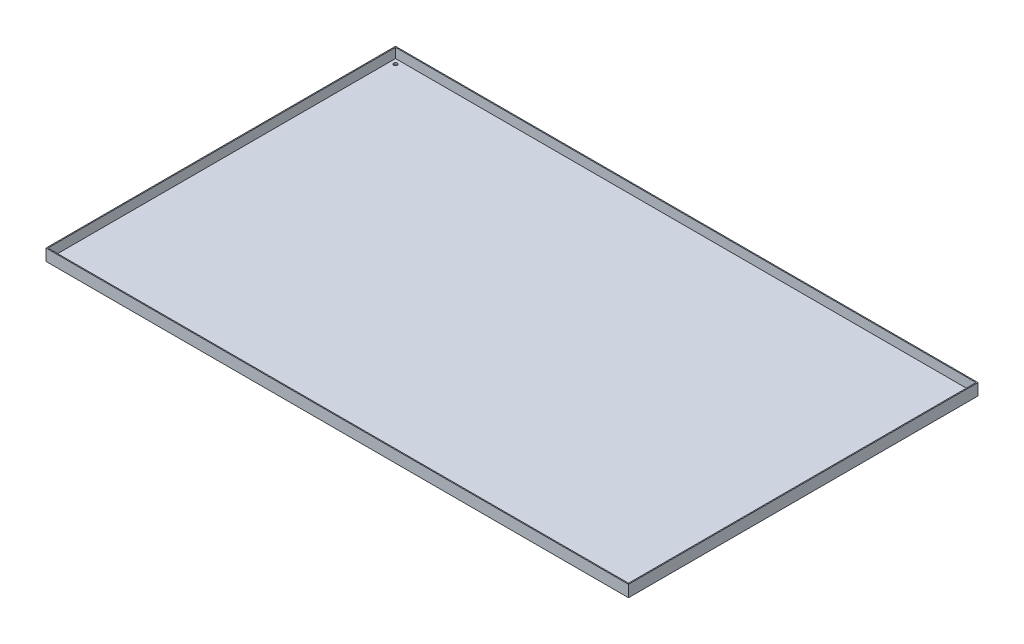
ISO-10303-21;
HEADER;
FILE_DESCRIPTION(('STEP AP214'),'2;1');
FILE_NAME('part.step','',(''),(''),'','','');
FILE_SCHEMA(('AUTOMOTIVE_DESIGN { 1 0 10303 214 1 1 1 1 }'));
ENDSEC;
DATA;
#1=APPLICATION_CONTEXT('core data for automotive mechanical design processes');
#2=APPLICATION_PROTOCOL_DEFINITION('international standard','automotive_design',2000,#1);
#3=PRODUCT_CONTEXT('',#1,'mechanical');
#4=PRODUCT('Part','Part','',(#3));
#5=PRODUCT_RELATED_PRODUCT_CATEGORY('part','',(#4));
#6=PRODUCT_DEFINITION_FORMATION('','',#4);
#7=PRODUCT_DEFINITION_CONTEXT('part definition',#1,'design');
#8=PRODUCT_DEFINITION('design','',#6,#7);
#9=PRODUCT_DEFINITION_SHAPE('','',#8);
#10=(LENGTH_UNIT() NAMED_UNIT(*) SI_UNIT(.MILLI.,.METRE.));
#11=(NAMED_UNIT(*) PLANE_ANGLE_UNIT() SI_UNIT($,.RADIAN.));
#12=(NAMED_UNIT(*) SI_UNIT($,.STERADIAN.) SOLID_ANGLE_UNIT());
#13=UNCERTAINTY_MEASURE_WITH_UNIT(LENGTH_MEASURE(1.E-05),#10,'distance_accuracy_value','');
#14=(GEOMETRIC_REPRESENTATION_CONTEXT(3) GLOBAL_UNCERTAINTY_ASSIGNED_CONTEXT((#13)) GLOBAL_UNIT_ASSIGNED_CONTEXT((#10,
#11,#12)) REPRESENTATION_CONTEXT('',''));
#15=CARTESIAN_POINT('',(0.,0.,0.));
#16=DIRECTION('',(0.,0.,1.));
#17=DIRECTION('',(1.,0.,0.));
#18=AXIS2_PLACEMENT_3D('',#15,#16,#17);
#19=CARTESIAN_POINT('',(0.,60.,0.));
#20=DIRECTION('',(1.,0.,0.));
#21=DIRECTION('',(0.,0.,-1.));
#22=AXIS2_PLACEMENT_3D('',#19,#20,#21);
#23=PLANE('',#22);
#24=DIRECTION('',(0.,0.,1.));
#25=VECTOR('',#24,1.);
#26=CARTESIAN_POINT('',(0.,0.,0.));
#27=LINE('',#26,#25);
#28=CARTESIAN_POINT('',(0.,0.,-1800.));
#29=VERTEX_POINT('',#28);
#30=CARTESIAN_POINT('',(0.,0.,0.));
#31=VERTEX_POINT('',#30);
#32=EDGE_CURVE('E162',#29,#31,#27,.T.);
#33=ORIENTED_EDGE('',*,*,#32,.T.);
#34=DIRECTION('',(0.,-1.,0.));
#35=VECTOR('',#34,1.);
#36=CARTESIAN_POINT('',(0.,60.,0.));
#37=LINE('',#36,#35);
#38=CARTESIAN_POINT('',(0.,60.,0.));
#39=VERTEX_POINT('',#38);
#40=EDGE_CURVE('E11',#39,#31,#37,.T.);
#41=ORIENTED_EDGE('',*,*,#40,.F.);
#42=DIRECTION('',(0.,0.,1.));
#43=VECTOR('',#42,1.);
#44=CARTESIAN_POINT('',(0.,60.,0.));
#45=LINE('',#44,#43);
#46=CARTESIAN_POINT('',(0.,60.,-1800.));
#47=VERTEX_POINT('',#46);
#48=EDGE_CURVE('E168',#47,#39,#45,.T.);
#49=ORIENTED_EDGE('',*,*,#48,.F.);
#50=DIRECTION('',(0.,-1.,0.));
#51=VECTOR('',#50,1.);
#52=CARTESIAN_POINT('',(0.,60.,-1800.));
#53=LINE('',#52,#51);
#54=EDGE_CURVE('E178',#47,#29,#53,.T.);
#55=ORIENTED_EDGE('',*,*,#54,.T.);
#56=EDGE_LOOP('',(#33,#41,#49,#55));
#57=FACE_BOUND('',#56,.T.);
#58=ADVANCED_FACE('F39',(#57),#23,.F.);
#59=CARTESIAN_POINT('',(0.,60.,0.));
#60=DIRECTION('',(0.,0.,-1.));
#61=DIRECTION('',(-1.,0.,0.));
#62=AXIS2_PLACEMENT_3D('',#59,#60,#61);
#63=PLANE('',#62);
#64=DIRECTION('',(1.,0.,0.));
#65=VECTOR('',#64,1.);
#66=CARTESIAN_POINT('',(0.,0.,0.));
#67=LINE('',#66,#65);
#68=CARTESIAN_POINT('',(3000.,0.,0.));
#69=VERTEX_POINT('',#68);
#70=EDGE_CURVE('E182',#31,#69,#67,.T.);
#71=ORIENTED_EDGE('',*,*,#70,.T.);
#72=DIRECTION('',(0.,-1.,0.));
#73=VECTOR('',#72,1.);
#74=CARTESIAN_POINT('',(3000.,60.,0.));
#75=LINE('',#74,#73);
#76=CARTESIAN_POINT('',(3000.,60.,0.));
#77=VERTEX_POINT('',#76);
#78=EDGE_CURVE('E47',#77,#69,#75,.T.);
#79=ORIENTED_EDGE('',*,*,#78,.F.);
#80=DIRECTION('',(1.,0.,0.));
#81=VECTOR('',#80,1.);
#82=CARTESIAN_POINT('',(0.,60.,0.));
#83=LINE('',#82,#81);
#84=EDGE_CURVE('E91',#39,#77,#83,.T.);
#85=ORIENTED_EDGE('',*,*,#84,.F.);
#86=ORIENTED_EDGE('',*,*,#40,.T.);
#87=EDGE_LOOP('',(#71,#79,#85,#86));
#88=FACE_BOUND('',#87,.T.);
#89=ADVANCED_FACE('F217',(#88),#63,.F.);
#90=CARTESIAN_POINT('',(3000.,60.,0.));
#91=DIRECTION('',(-1.,0.,0.));
#92=DIRECTION('',(0.,0.,1.));
#93=AXIS2_PLACEMENT_3D('',#90,#91,#92);
#94=PLANE('',#93);
#95=DIRECTION('',(0.,0.,-1.));
#96=VECTOR('',#95,1.);
#97=CARTESIAN_POINT('',(3000.,0.,0.));
#98=LINE('',#97,#96);
#99=CARTESIAN_POINT('',(3000.,0.,-1800.));
#100=VERTEX_POINT('',#99);
#101=EDGE_CURVE('E185',#69,#100,#98,.T.);
#102=ORIENTED_EDGE('',*,*,#101,.T.);
#103=DIRECTION('',(0.,-1.,0.));
#104=VECTOR('',#103,1.);
#105=CARTESIAN_POINT('',(3000.,60.,-1800.));
#106=LINE('',#105,#104);
#107=CARTESIAN_POINT('',(3000.,60.,-1800.));
#108=VERTEX_POINT('',#107);
#109=EDGE_CURVE('E192',#108,#100,#106,.T.);
#110=ORIENTED_EDGE('',*,*,#109,.F.);
#111=DIRECTION('',(0.,0.,-1.));
#112=VECTOR('',#111,1.);
#113=CARTESIAN_POINT('',(3000.,60.,0.));
#114=LINE('',#113,#112);
#115=EDGE_CURVE('E173',#77,#108,#114,.T.);
#116=ORIENTED_EDGE('',*,*,#115,.F.);
#117=ORIENTED_EDGE('',*,*,#78,.T.);
#118=EDGE_LOOP('',(#102,#110,#116,#117));
#119=FACE_BOUND('',#118,.T.);
#120=ADVANCED_FACE('F199',(#119),#94,.F.);
#121=CARTESIAN_POINT('',(0.,60.,-1800.));
#122=DIRECTION('',(0.,0.,1.));
#123=DIRECTION('',(1.,0.,0.));
#124=AXIS2_PLACEMENT_3D('',#121,#122,#123);
#125=PLANE('',#124);
#126=DIRECTION('',(-1.,0.,0.));
#127=VECTOR('',#126,1.);
#128=CARTESIAN_POINT('',(0.,0.,-1800.));
#129=LINE('',#128,#127);
#130=EDGE_CURVE('E84',#100,#29,#129,.T.);
#131=ORIENTED_EDGE('',*,*,#130,.T.);
#132=ORIENTED_EDGE('',*,*,#54,.F.);
#133=DIRECTION('',(-1.,0.,0.));
#134=VECTOR('',#133,1.);
#135=CARTESIAN_POINT('',(0.,60.,-1800.));
#136=LINE('',#135,#134);
#137=EDGE_CURVE('E63',#108,#47,#136,.T.);
#138=ORIENTED_EDGE('',*,*,#137,.F.);
#139=ORIENTED_EDGE('',*,*,#109,.T.);
#140=EDGE_LOOP('',(#131,#132,#138,#139));
#141=FACE_BOUND('',#140,.T.);
#142=ADVANCED_FACE('F207',(#141),#125,.F.);
#143=CARTESIAN_POINT('',(0.,60.,0.));
#144=DIRECTION('',(0.,-1.,0.));
#145=DIRECTION('',(0.,0.,-1.));
#146=AXIS2_PLACEMENT_3D('',#143,#144,#145);
#147=PLANE('',#146);
#148=DIRECTION('',(1.,0.,0.));
#149=VECTOR('',#148,1.);
#150=CARTESIAN_POINT('',(5.00000000000022,60.,-5.));
#151=LINE('',#150,#149);
#152=CARTESIAN_POINT('',(5.00000000000022,60.,-5.));
#153=VERTEX_POINT('',#152);
#154=CARTESIAN_POINT('',(2995.,60.,-5.));
#155=VERTEX_POINT('',#154);
#156=EDGE_CURVE('E152',#153,#155,#151,.T.);
#157=ORIENTED_EDGE('',*,*,#156,.F.);
#158=DIRECTION('',(0.,0.,1.));
#159=VECTOR('',#158,1.);
#160=CARTESIAN_POINT('',(5.,60.,-1795.));
#161=LINE('',#160,#159);
#162=CARTESIAN_POINT('',(5.,60.,-1795.));
#163=VERTEX_POINT('',#162);
#164=EDGE_CURVE('E54',#163,#153,#161,.T.);
#165=ORIENTED_EDGE('',*,*,#164,.F.);
#166=DIRECTION('',(-1.,0.,0.));
#167=VECTOR('',#166,1.);
#168=CARTESIAN_POINT('',(5.,60.,-1795.));
#169=LINE('',#168,#167);
#170=CARTESIAN_POINT('',(2995.,60.,-1795.));
#171=VERTEX_POINT('',#170);
#172=EDGE_CURVE('E136',#171,#163,#169,.T.);
#173=ORIENTED_EDGE('',*,*,#172,.F.);
#174=DIRECTION('',(0.,0.,-1.));
#175=VECTOR('',#174,1.);
#176=CARTESIAN_POINT('',(2995.,60.,-1795.));
#177=LINE('',#176,#175);
#178=EDGE_CURVE('E140',#155,#171,#177,.T.);
#179=ORIENTED_EDGE('',*,*,#178,.F.);
#180=EDGE_LOOP('',(#157,#165,#173,#179));
#181=FACE_BOUND('',#180,.T.);
#182=ORIENTED_EDGE('',*,*,#48,.T.);
#183=ORIENTED_EDGE('',*,*,#84,.T.);
#184=ORIENTED_EDGE('',*,*,#115,.T.);
#185=ORIENTED_EDGE('',*,*,#137,.T.);
#186=EDGE_LOOP('',(#182,#183,#184,#185));
#187=FACE_BOUND('',#186,.T.);
#188=ADVANCED_FACE('F209',(#181,#187),#147,.F.);
#189=CARTESIAN_POINT('',(0.,0.,0.));
#190=DIRECTION('',(0.,-1.,0.));
#191=DIRECTION('',(0.,0.,-1.));
#192=AXIS2_PLACEMENT_3D('',#189,#190,#191);
#193=PLANE('',#192);
#194=CARTESIAN_POINT('',(2970.,0.,-1770.));
#195=DIRECTION('',(0.,1.,0.));
#196=DIRECTION('',(0.,0.,-1.));
#197=AXIS2_PLACEMENT_3D('',#194,#195,#196);
#198=CIRCLE('',#197,10.0000000000001);
#199=CARTESIAN_POINT('',(2970.,0.,-1780.));
#200=VERTEX_POINT('',#199);
#201=EDGE_CURVE('E340',#200,#200,#198,.T.);
#202=ORIENTED_EDGE('',*,*,#201,.T.);
#203=EDGE_LOOP('',(#202));
#204=FACE_BOUND('',#203,.T.);
#205=CARTESIAN_POINT('',(29.9999999999996,0.,-29.9999999999998));
#206=DIRECTION('',(0.,1.,0.));
#207=DIRECTION('',(0.,0.,-1.));
#208=AXIS2_PLACEMENT_3D('',#205,#206,#207);
#209=CIRCLE('',#208,10.);
#210=CARTESIAN_POINT('',(29.9999999999996,0.,-39.9999999999998));
#211=VERTEX_POINT('',#210);
#212=EDGE_CURVE('E345',#211,#211,#209,.T.);
#213=ORIENTED_EDGE('',*,*,#212,.T.);
#214=EDGE_LOOP('',(#213));
#215=FACE_BOUND('',#214,.T.);
#216=CARTESIAN_POINT('',(2970.,0.,-29.9999999999994));
#217=DIRECTION('',(0.,1.,0.));
#218=DIRECTION('',(0.,0.,1.));
#219=AXIS2_PLACEMENT_3D('',#216,#217,#218);
#220=CIRCLE('',#219,10.0000000000001);
#221=CARTESIAN_POINT('',(2970.,0.,-19.9999999999993));
#222=VERTEX_POINT('',#221);
#223=EDGE_CURVE('E357',#222,#222,#220,.T.);
#224=ORIENTED_EDGE('',*,*,#223,.T.);
#225=EDGE_LOOP('',(#224));
#226=FACE_BOUND('',#225,.T.);
#227=CARTESIAN_POINT('',(30.,0.,-1770.));
#228=DIRECTION('',(0.,1.,0.));
#229=DIRECTION('',(0.,0.,1.));
#230=AXIS2_PLACEMENT_3D('',#227,#228,#229);
#231=CIRCLE('',#230,10.);
#232=CARTESIAN_POINT('',(30.,0.,-1760.));
#233=VERTEX_POINT('',#232);
#234=EDGE_CURVE('E153',#233,#233,#231,.T.);
#235=ORIENTED_EDGE('',*,*,#234,.T.);
#236=EDGE_LOOP('',(#235));
#237=FACE_BOUND('',#236,.T.);
#238=ORIENTED_EDGE('',*,*,#32,.F.);
#239=ORIENTED_EDGE('',*,*,#130,.F.);
#240=ORIENTED_EDGE('',*,*,#101,.F.);
#241=ORIENTED_EDGE('',*,*,#70,.F.);
#242=EDGE_LOOP('',(#238,#239,#240,#241));
#243=FACE_BOUND('',#242,.T.);
#244=ADVANCED_FACE('F203',(#204,#215,#226,#237,#243),#193,.T.);
#245=CARTESIAN_POINT('',(5.,9.99999999999999,-1795.));
#246=DIRECTION('',(-1.,0.,0.));
#247=DIRECTION('',(0.,0.,1.));
#248=AXIS2_PLACEMENT_3D('',#245,#246,#247);
#249=PLANE('',#248);
#250=ORIENTED_EDGE('',*,*,#164,.T.);
#251=DIRECTION('',(0.,1.,0.));
#252=VECTOR('',#251,1.);
#253=CARTESIAN_POINT('',(5.00000000000022,9.99999999999999,-5.));
#254=LINE('',#253,#252);
#255=CARTESIAN_POINT('',(5.00000000000022,9.99999999999999,-5.));
#256=VERTEX_POINT('',#255);
#257=EDGE_CURVE('E111',#256,#153,#254,.T.);
#258=ORIENTED_EDGE('',*,*,#257,.F.);
#259=DIRECTION('',(0.,0.,1.));
#260=VECTOR('',#259,1.);
#261=CARTESIAN_POINT('',(5.,9.99999999999999,-1795.));
#262=LINE('',#261,#260);
#263=CARTESIAN_POINT('',(5.,9.99999999999999,-1795.));
#264=VERTEX_POINT('',#263);
#265=EDGE_CURVE('E115',#264,#256,#262,.T.);
#266=ORIENTED_EDGE('',*,*,#265,.F.);
#267=DIRECTION('',(0.,1.,0.));
#268=VECTOR('',#267,1.);
#269=CARTESIAN_POINT('',(5.,9.99999999999999,-1795.));
#270=LINE('',#269,#268);
#271=EDGE_CURVE('E159',#264,#163,#270,.T.);
#272=ORIENTED_EDGE('',*,*,#271,.T.);
#273=EDGE_LOOP('',(#250,#258,#266,#272));
#274=FACE_BOUND('',#273,.T.);
#275=ADVANCED_FACE('F113',(#274),#249,.F.);
#276=CARTESIAN_POINT('',(5.,9.99999999999999,-1795.));
#277=DIRECTION('',(0.,0.,-1.));
#278=DIRECTION('',(-1.,0.,0.));
#279=AXIS2_PLACEMENT_3D('',#276,#277,#278);
#280=PLANE('',#279);
#281=ORIENTED_EDGE('',*,*,#172,.T.);
#282=ORIENTED_EDGE('',*,*,#271,.F.);
#283=DIRECTION('',(-1.,0.,0.));
#284=VECTOR('',#283,1.);
#285=CARTESIAN_POINT('',(5.,9.99999999999999,-1795.));
#286=LINE('',#285,#284);
#287=CARTESIAN_POINT('',(2995.,9.99999999999999,-1795.));
#288=VERTEX_POINT('',#287);
#289=EDGE_CURVE('E122',#288,#264,#286,.T.);
#290=ORIENTED_EDGE('',*,*,#289,.F.);
#291=DIRECTION('',(0.,1.,0.));
#292=VECTOR('',#291,1.);
#293=CARTESIAN_POINT('',(2995.,9.99999999999999,-1795.));
#294=LINE('',#293,#292);
#295=EDGE_CURVE('E163',#288,#171,#294,.T.);
#296=ORIENTED_EDGE('',*,*,#295,.T.);
#297=EDGE_LOOP('',(#281,#282,#290,#296));
#298=FACE_BOUND('',#297,.T.);
#299=ADVANCED_FACE('F251',(#298),#280,.F.);
#300=CARTESIAN_POINT('',(2995.,9.99999999999999,-1795.));
#301=DIRECTION('',(1.,0.,0.));
#302=DIRECTION('',(0.,0.,-1.));
#303=AXIS2_PLACEMENT_3D('',#300,#301,#302);
#304=PLANE('',#303);
#305=ORIENTED_EDGE('',*,*,#178,.T.);
#306=ORIENTED_EDGE('',*,*,#295,.F.);
#307=DIRECTION('',(0.,0.,-1.));
#308=VECTOR('',#307,1.);
#309=CARTESIAN_POINT('',(2995.,9.99999999999999,-1795.));
#310=LINE('',#309,#308);
#311=CARTESIAN_POINT('',(2995.,9.99999999999999,-5.));
#312=VERTEX_POINT('',#311);
#313=EDGE_CURVE('E131',#312,#288,#310,.T.);
#314=ORIENTED_EDGE('',*,*,#313,.F.);
#315=DIRECTION('',(0.,1.,0.));
#316=VECTOR('',#315,1.);
#317=CARTESIAN_POINT('',(2995.,9.99999999999999,-5.));
#318=LINE('',#317,#316);
#319=EDGE_CURVE('E121',#312,#155,#318,.T.);
#320=ORIENTED_EDGE('',*,*,#319,.T.);
#321=EDGE_LOOP('',(#305,#306,#314,#320));
#322=FACE_BOUND('',#321,.T.);
#323=ADVANCED_FACE('F260',(#322),#304,.F.);
#324=CARTESIAN_POINT('',(5.00000000000022,9.99999999999999,-5.));
#325=DIRECTION('',(0.,0.,1.));
#326=DIRECTION('',(1.,0.,0.));
#327=AXIS2_PLACEMENT_3D('',#324,#325,#326);
#328=PLANE('',#327);
#329=ORIENTED_EDGE('',*,*,#156,.T.);
#330=ORIENTED_EDGE('',*,*,#319,.F.);
#331=DIRECTION('',(1.,0.,0.));
#332=VECTOR('',#331,1.);
#333=CARTESIAN_POINT('',(5.00000000000022,9.99999999999999,-5.));
#334=LINE('',#333,#332);
#335=EDGE_CURVE('E125',#256,#312,#334,.T.);
#336=ORIENTED_EDGE('',*,*,#335,.F.);
#337=ORIENTED_EDGE('',*,*,#257,.T.);
#338=EDGE_LOOP('',(#329,#330,#336,#337));
#339=FACE_BOUND('',#338,.T.);
#340=ADVANCED_FACE('F126',(#339),#328,.F.);
#341=CARTESIAN_POINT('',(0.,9.99999999999999,0.));
#342=DIRECTION('',(0.,1.,0.));
#343=DIRECTION('',(0.,0.,1.));
#344=AXIS2_PLACEMENT_3D('',#341,#342,#343);
#345=PLANE('',#344);
#346=CARTESIAN_POINT('',(2970.,9.99999999999999,-1770.));
#347=DIRECTION('',(0.,1.,0.));
#348=DIRECTION('',(0.,0.,-1.));
#349=AXIS2_PLACEMENT_3D('',#346,#347,#348);
#350=CIRCLE('',#349,10.0000000000001);
#351=CARTESIAN_POINT('',(2970.,9.99999999999999,-1780.));
#352=VERTEX_POINT('',#351);
#353=EDGE_CURVE('E343',#352,#352,#350,.T.);
#354=ORIENTED_EDGE('',*,*,#353,.F.);
#355=EDGE_LOOP('',(#354));
#356=FACE_BOUND('',#355,.T.);
#357=CARTESIAN_POINT('',(29.9999999999996,9.99999999999999,-29.9999999999998));
#358=DIRECTION('',(0.,1.,0.));
#359=DIRECTION('',(0.,0.,-1.));
#360=AXIS2_PLACEMENT_3D('',#357,#358,#359);
#361=CIRCLE('',#360,10.);
#362=CARTESIAN_POINT('',(29.9999999999996,9.99999999999999,-39.9999999999998));
#363=VERTEX_POINT('',#362);
#364=EDGE_CURVE('E351',#363,#363,#361,.T.);
#365=ORIENTED_EDGE('',*,*,#364,.F.);
#366=EDGE_LOOP('',(#365));
#367=FACE_BOUND('',#366,.T.);
#368=CARTESIAN_POINT('',(2970.,9.99999999999999,-29.9999999999994));
#369=DIRECTION('',(0.,1.,0.));
#370=DIRECTION('',(0.,0.,1.));
#371=AXIS2_PLACEMENT_3D('',#368,#369,#370);
#372=CIRCLE('',#371,10.0000000000001);
#373=CARTESIAN_POINT('',(2970.,9.99999999999999,-19.9999999999993));
#374=VERTEX_POINT('',#373);
#375=EDGE_CURVE('E371',#374,#374,#372,.T.);
#376=ORIENTED_EDGE('',*,*,#375,.F.);
#377=EDGE_LOOP('',(#376));
#378=FACE_BOUND('',#377,.T.);
#379=CARTESIAN_POINT('',(30.,9.99999999999999,-1770.));
#380=DIRECTION('',(0.,1.,0.));
#381=DIRECTION('',(0.,0.,1.));
#382=AXIS2_PLACEMENT_3D('',#379,#380,#381);
#383=CIRCLE('',#382,10.);
#384=CARTESIAN_POINT('',(30.,9.99999999999999,-1760.));
#385=VERTEX_POINT('',#384);
#386=EDGE_CURVE('E143',#385,#385,#383,.T.);
#387=ORIENTED_EDGE('',*,*,#386,.F.);
#388=EDGE_LOOP('',(#387));
#389=FACE_BOUND('',#388,.T.);
#390=ORIENTED_EDGE('',*,*,#265,.T.);
#391=ORIENTED_EDGE('',*,*,#335,.T.);
#392=ORIENTED_EDGE('',*,*,#313,.T.);
#393=ORIENTED_EDGE('',*,*,#289,.T.);
#394=EDGE_LOOP('',(#390,#391,#392,#393));
#395=FACE_BOUND('',#394,.T.);
#396=ADVANCED_FACE('F133',(#356,#367,#378,#389,#395),#345,.T.);
#397=CARTESIAN_POINT('',(30.,0.,-1770.));
#398=DIRECTION('',(0.,1.,0.));
#399=DIRECTION('',(0.,0.,1.));
#400=AXIS2_PLACEMENT_3D('',#397,#398,#399);
#401=CYLINDRICAL_SURFACE('',#400,10.);
#402=ORIENTED_EDGE('',*,*,#234,.F.);
#403=EDGE_LOOP('',(#402));
#404=FACE_BOUND('',#403,.T.);
#405=ORIENTED_EDGE('',*,*,#386,.T.);
#406=EDGE_LOOP('',(#405));
#407=FACE_BOUND('',#406,.T.);
#408=ADVANCED_FACE('F293',(#404,#407),#401,.F.);
#409=CARTESIAN_POINT('',(2970.,0.,-29.9999999999994));
#410=DIRECTION('',(0.,1.,0.));
#411=DIRECTION('',(0.,0.,1.));
#412=AXIS2_PLACEMENT_3D('',#409,#410,#411);
#413=CYLINDRICAL_SURFACE('',#412,10.0000000000001);
#414=ORIENTED_EDGE('',*,*,#223,.F.);
#415=EDGE_LOOP('',(#414));
#416=FACE_BOUND('',#415,.T.);
#417=ORIENTED_EDGE('',*,*,#375,.T.);
#418=EDGE_LOOP('',(#417));
#419=FACE_BOUND('',#418,.T.);
#420=ADVANCED_FACE('F303',(#416,#419),#413,.F.);
#421=CARTESIAN_POINT('',(29.9999999999996,0.,-29.9999999999998));
#422=DIRECTION('',(0.,1.,0.));
#423=DIRECTION('',(0.,0.,1.));
#424=AXIS2_PLACEMENT_3D('',#421,#422,#423);
#425=CYLINDRICAL_SURFACE('',#424,10.);
#426=ORIENTED_EDGE('',*,*,#212,.F.);
#427=EDGE_LOOP('',(#426));
#428=FACE_BOUND('',#427,.T.);
#429=ORIENTED_EDGE('',*,*,#364,.T.);
#430=EDGE_LOOP('',(#429));
#431=FACE_BOUND('',#430,.T.);
#432=ADVANCED_FACE('F313',(#428,#431),#425,.F.);
#433=CARTESIAN_POINT('',(2970.,0.,-1770.));
#434=DIRECTION('',(0.,1.,0.));
#435=DIRECTION('',(0.,0.,1.));
#436=AXIS2_PLACEMENT_3D('',#433,#434,#435);
#437=CYLINDRICAL_SURFACE('',#436,10.0000000000001);
#438=ORIENTED_EDGE('',*,*,#201,.F.);
#439=EDGE_LOOP('',(#438));
#440=FACE_BOUND('',#439,.T.);
#441=ORIENTED_EDGE('',*,*,#353,.T.);
#442=EDGE_LOOP('',(#441));
#443=FACE_BOUND('',#442,.T.);
#444=ADVANCED_FACE('F323',(#440,#443),#437,.F.);
#445=CLOSED_SHELL('',(#58,#89,#120,#142,#188,#244,#275,#299,#323,#340,#396,#408,#420,#432,#444));
#446=MANIFOLD_SOLID_BREP('B2',#445);
#447=ADVANCED_BREP_SHAPE_REPRESENTATION('',(#18,#446),#14);
#448=SHAPE_DEFINITION_REPRESENTATION(#9,#447);
ENDSEC;
END-ISO-10303-21;
